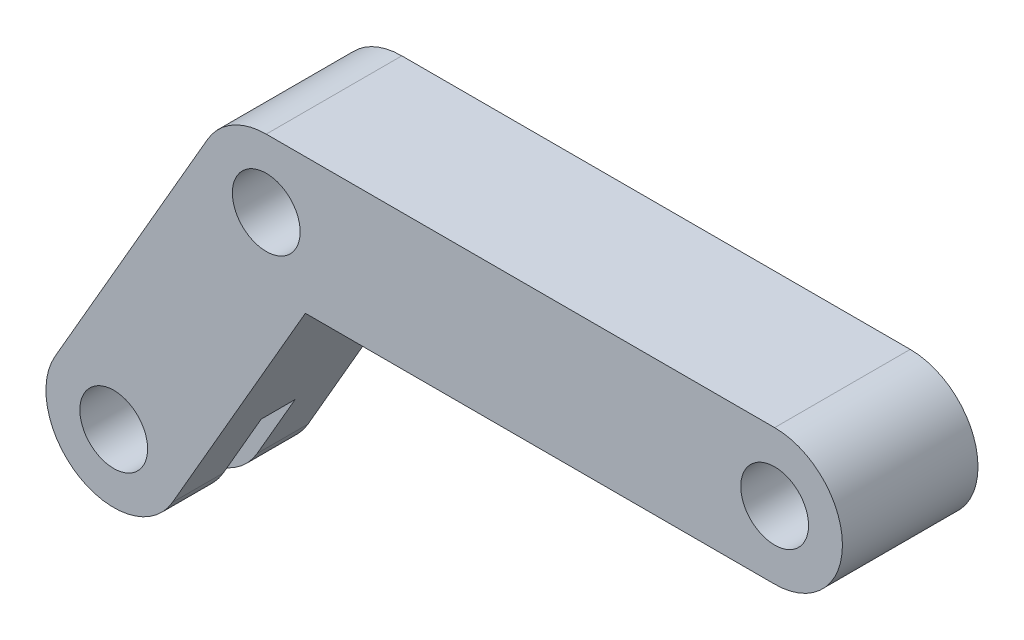
ISO-10303-21;
HEADER;
FILE_DESCRIPTION(('STEP AP214'),'2;1');
FILE_NAME('part.step','',(''),(''),'','','');
FILE_SCHEMA(('AUTOMOTIVE_DESIGN { 1 0 10303 214 1 1 1 1 }'));
ENDSEC;
DATA;
#1=APPLICATION_CONTEXT('core data for automotive mechanical design processes');
#2=APPLICATION_PROTOCOL_DEFINITION('international standard','automotive_design',2000,#1);
#3=PRODUCT_CONTEXT('',#1,'mechanical');
#4=PRODUCT('Part','Part','',(#3));
#5=PRODUCT_RELATED_PRODUCT_CATEGORY('part','',(#4));
#6=PRODUCT_DEFINITION_FORMATION('','',#4);
#7=PRODUCT_DEFINITION_CONTEXT('part definition',#1,'design');
#8=PRODUCT_DEFINITION('design','',#6,#7);
#9=PRODUCT_DEFINITION_SHAPE('','',#8);
#10=(LENGTH_UNIT() NAMED_UNIT(*) SI_UNIT(.MILLI.,.METRE.));
#11=(NAMED_UNIT(*) PLANE_ANGLE_UNIT() SI_UNIT($,.RADIAN.));
#12=(NAMED_UNIT(*) SI_UNIT($,.STERADIAN.) SOLID_ANGLE_UNIT());
#13=UNCERTAINTY_MEASURE_WITH_UNIT(LENGTH_MEASURE(1.E-05),#10,'distance_accuracy_value','');
#14=(GEOMETRIC_REPRESENTATION_CONTEXT(3) GLOBAL_UNCERTAINTY_ASSIGNED_CONTEXT((#13)) GLOBAL_UNIT_ASSIGNED_CONTEXT((#10,
#11,#12)) REPRESENTATION_CONTEXT('',''));
#15=CARTESIAN_POINT('',(0.,0.,0.));
#16=DIRECTION('',(0.,0.,1.));
#17=DIRECTION('',(1.,0.,0.));
#18=AXIS2_PLACEMENT_3D('',#15,#16,#17);
#19=CARTESIAN_POINT('',(5.77350269189626,-10.,20.));
#20=DIRECTION('',(-0.866025403784439,0.5,0.));
#21=DIRECTION('',(-0.5,-0.866025403784439,0.));
#22=AXIS2_PLACEMENT_3D('',#19,#20,#21);
#23=PLANE('',#22);
#24=DIRECTION('',(-0.5,-0.866025403784439,0.));
#25=VECTOR('',#24,1.);
#26=CARTESIAN_POINT('',(5.77350269189626,-10.,12.5));
#27=LINE('',#26,#25);
#28=CARTESIAN_POINT('',(-8.24957601840623,-34.2886848047814,12.5));
#29=VERTEX_POINT('',#28);
#30=CARTESIAN_POINT('',(-13.8397459621558,-43.9711431702996,12.5));
#31=VERTEX_POINT('',#30);
#32=EDGE_CURVE('E191',#29,#31,#27,.T.);
#33=ORIENTED_EDGE('',*,*,#32,.F.);
#34=DIRECTION('',(0.,0.,-1.));
#35=VECTOR('',#34,1.);
#36=CARTESIAN_POINT('',(-8.24957601840623,-34.2886848047814,12.5));
#37=LINE('',#36,#35);
#38=CARTESIAN_POINT('',(-8.24957601840623,-34.2886848047814,7.5));
#39=VERTEX_POINT('',#38);
#40=EDGE_CURVE('E196',#29,#39,#37,.T.);
#41=ORIENTED_EDGE('',*,*,#40,.T.);
#42=DIRECTION('',(-0.5,-0.866025403784439,0.));
#43=VECTOR('',#42,1.);
#44=CARTESIAN_POINT('',(5.77350269189626,-10.,7.5));
#45=LINE('',#44,#43);
#46=CARTESIAN_POINT('',(-13.8397459621558,-43.9711431702996,7.5));
#47=VERTEX_POINT('',#46);
#48=EDGE_CURVE('E176',#39,#47,#45,.T.);
#49=ORIENTED_EDGE('',*,*,#48,.T.);
#50=DIRECTION('',(0.,0.,-1.));
#51=VECTOR('',#50,1.);
#52=CARTESIAN_POINT('',(-13.8397459621558,-43.9711431702996,20.));
#53=LINE('',#52,#51);
#54=CARTESIAN_POINT('',(-13.8397459621558,-43.9711431702996,0.));
#55=VERTEX_POINT('',#54);
#56=EDGE_CURVE('E91',#47,#55,#53,.T.);
#57=ORIENTED_EDGE('',*,*,#56,.T.);
#58=DIRECTION('',(0.5,0.866025403784439,0.));
#59=VECTOR('',#58,1.);
#60=CARTESIAN_POINT('',(5.77350269189626,-10.,0.));
#61=LINE('',#60,#59);
#62=CARTESIAN_POINT('',(5.77350269189626,-10.,0.));
#63=VERTEX_POINT('',#62);
#64=EDGE_CURVE('E144',#55,#63,#61,.T.);
#65=ORIENTED_EDGE('',*,*,#64,.T.);
#66=DIRECTION('',(0.,0.,-1.));
#67=VECTOR('',#66,1.);
#68=CARTESIAN_POINT('',(5.77350269189626,-10.,20.));
#69=LINE('',#68,#67);
#70=CARTESIAN_POINT('',(5.77350269189626,-10.,20.));
#71=VERTEX_POINT('',#70);
#72=EDGE_CURVE('E46',#71,#63,#69,.T.);
#73=ORIENTED_EDGE('',*,*,#72,.F.);
#74=DIRECTION('',(0.5,0.866025403784439,0.));
#75=VECTOR('',#74,1.);
#76=CARTESIAN_POINT('',(5.77350269189626,-10.,20.));
#77=LINE('',#76,#75);
#78=CARTESIAN_POINT('',(-13.8397459621558,-43.9711431702996,20.));
#79=VERTEX_POINT('',#78);
#80=EDGE_CURVE('E157',#79,#71,#77,.T.);
#81=ORIENTED_EDGE('',*,*,#80,.F.);
#82=EDGE_CURVE('E159',#79,#31,#53,.T.);
#83=ORIENTED_EDGE('',*,*,#82,.T.);
#84=EDGE_LOOP('',(#33,#41,#49,#57,#65,#73,#81,#83));
#85=FACE_BOUND('',#84,.T.);
#86=ADVANCED_FACE('F39',(#85),#23,.F.);
#87=CARTESIAN_POINT('',(-8.66025403784441,4.99999999999996,20.));
#88=DIRECTION('',(0.866025403784439,-0.5,0.));
#89=DIRECTION('',(0.5,0.866025403784439,0.));
#90=AXIS2_PLACEMENT_3D('',#87,#88,#89);
#91=PLANE('',#90);
#92=DIRECTION('',(0.5,0.866025403784439,0.));
#93=VECTOR('',#92,1.);
#94=CARTESIAN_POINT('',(-8.66025403784441,4.99999999999996,12.5));
#95=LINE('',#94,#93);
#96=CARTESIAN_POINT('',(-31.1602540378446,-33.9711431702996,12.5));
#97=VERTEX_POINT('',#96);
#98=CARTESIAN_POINT('',(-25.5700840940948,-24.288684804781,12.5));
#99=VERTEX_POINT('',#98);
#100=EDGE_CURVE('E184',#97,#99,#95,.T.);
#101=ORIENTED_EDGE('',*,*,#100,.F.);
#102=DIRECTION('',(0.,0.,-1.));
#103=VECTOR('',#102,1.);
#104=CARTESIAN_POINT('',(-31.1602540378444,-33.9711431702997,20.));
#105=LINE('',#104,#103);
#106=CARTESIAN_POINT('',(-31.1602540378444,-33.9711431702997,20.));
#107=VERTEX_POINT('',#106);
#108=EDGE_CURVE('E137',#107,#97,#105,.T.);
#109=ORIENTED_EDGE('',*,*,#108,.F.);
#110=DIRECTION('',(-0.5,-0.866025403784438,0.));
#111=VECTOR('',#110,1.);
#112=CARTESIAN_POINT('',(-8.66025403784441,4.99999999999996,20.));
#113=LINE('',#112,#111);
#114=CARTESIAN_POINT('',(-8.66025403784441,4.99999999999996,20.));
#115=VERTEX_POINT('',#114);
#116=EDGE_CURVE('E116',#115,#107,#113,.T.);
#117=ORIENTED_EDGE('',*,*,#116,.F.);
#118=DIRECTION('',(0.,0.,-1.));
#119=VECTOR('',#118,1.);
#120=CARTESIAN_POINT('',(-8.66025403784441,4.99999999999996,20.));
#121=LINE('',#120,#119);
#122=CARTESIAN_POINT('',(-8.66025403784441,4.99999999999996,0.));
#123=VERTEX_POINT('',#122);
#124=EDGE_CURVE('E126',#115,#123,#121,.T.);
#125=ORIENTED_EDGE('',*,*,#124,.T.);
#126=DIRECTION('',(-0.5,-0.866025403784438,0.));
#127=VECTOR('',#126,1.);
#128=CARTESIAN_POINT('',(-8.66025403784441,4.99999999999996,0.));
#129=LINE('',#128,#127);
#130=CARTESIAN_POINT('',(-31.1602540378444,-33.9711431702997,0.));
#131=VERTEX_POINT('',#130);
#132=EDGE_CURVE('E154',#123,#131,#129,.T.);
#133=ORIENTED_EDGE('',*,*,#132,.T.);
#134=CARTESIAN_POINT('',(-31.1602540378444,-33.9711431702997,7.5));
#135=VERTEX_POINT('',#134);
#136=EDGE_CURVE('E162',#135,#131,#105,.T.);
#137=ORIENTED_EDGE('',*,*,#136,.F.);
#138=DIRECTION('',(0.5,0.866025403784439,0.));
#139=VECTOR('',#138,1.);
#140=CARTESIAN_POINT('',(-8.66025403784441,4.99999999999996,7.5));
#141=LINE('',#140,#139);
#142=CARTESIAN_POINT('',(-25.5700840940948,-24.288684804781,7.5));
#143=VERTEX_POINT('',#142);
#144=EDGE_CURVE('E52',#135,#143,#141,.T.);
#145=ORIENTED_EDGE('',*,*,#144,.T.);
#146=DIRECTION('',(0.,0.,-1.));
#147=VECTOR('',#146,1.);
#148=CARTESIAN_POINT('',(-25.5700840940948,-24.288684804781,12.5));
#149=LINE('',#148,#147);
#150=EDGE_CURVE('E11',#143,#99,#149,.F.);
#151=ORIENTED_EDGE('',*,*,#150,.T.);
#152=EDGE_LOOP('',(#101,#109,#117,#125,#133,#137,#145,#151));
#153=FACE_BOUND('',#152,.T.);
#154=ADVANCED_FACE('F139',(#153),#91,.F.);
#155=CARTESIAN_POINT('',(-22.5000000000002,-38.9711431702996,20.));
#156=DIRECTION('',(0.,0.,-1.));
#157=DIRECTION('',(-1.,0.,0.));
#158=AXIS2_PLACEMENT_3D('',#155,#156,#157);
#159=CYLINDRICAL_SURFACE('',#158,10.);
#160=CARTESIAN_POINT('',(-22.5000000000002,-38.9711431702996,12.5));
#161=DIRECTION('',(0.,0.,-1.));
#162=DIRECTION('',(-1.,0.,0.));
#163=AXIS2_PLACEMENT_3D('',#160,#161,#162);
#164=CIRCLE('',#163,10.);
#165=EDGE_CURVE('E179',#31,#97,#164,.T.);
#166=ORIENTED_EDGE('',*,*,#165,.F.);
#167=ORIENTED_EDGE('',*,*,#82,.F.);
#168=CARTESIAN_POINT('',(-22.5000000000002,-38.9711431702996,20.));
#169=DIRECTION('',(0.,0.,1.));
#170=DIRECTION('',(-1.,0.,0.));
#171=AXIS2_PLACEMENT_3D('',#168,#169,#170);
#172=CIRCLE('',#171,10.);
#173=EDGE_CURVE('E65',#107,#79,#172,.T.);
#174=ORIENTED_EDGE('',*,*,#173,.F.);
#175=ORIENTED_EDGE('',*,*,#108,.T.);
#176=EDGE_LOOP('',(#166,#167,#174,#175));
#177=FACE_BOUND('',#176,.T.);
#178=ADVANCED_FACE('F256',(#177),#159,.T.);
#179=CARTESIAN_POINT('',(-22.5000000000002,-38.9711431702996,20.));
#180=DIRECTION('',(0.,0.,-1.));
#181=DIRECTION('',(-1.,0.,0.));
#182=AXIS2_PLACEMENT_3D('',#179,#180,#181);
#183=CYLINDRICAL_SURFACE('',#182,5.);
#184=CARTESIAN_POINT('',(-22.5000000000002,-38.9711431702996,20.));
#185=DIRECTION('',(0.,0.,1.));
#186=DIRECTION('',(1.,0.,0.));
#187=AXIS2_PLACEMENT_3D('',#184,#185,#186);
#188=CIRCLE('',#187,5.);
#189=CARTESIAN_POINT('',(-17.5000000000002,-38.9711431702996,20.));
#190=VERTEX_POINT('',#189);
#191=EDGE_CURVE('E146',#190,#190,#188,.T.);
#192=ORIENTED_EDGE('',*,*,#191,.T.);
#193=EDGE_LOOP('',(#192));
#194=FACE_BOUND('',#193,.T.);
#195=CARTESIAN_POINT('',(-22.5000000000002,-38.9711431702996,12.5));
#196=DIRECTION('',(0.,0.,-1.));
#197=DIRECTION('',(-1.,0.,0.));
#198=AXIS2_PLACEMENT_3D('',#195,#196,#197);
#199=CIRCLE('',#198,5.);
#200=CARTESIAN_POINT('',(-27.5000000000002,-38.9711431702996,12.5));
#201=VERTEX_POINT('',#200);
#202=EDGE_CURVE('E180',#201,#201,#199,.T.);
#203=ORIENTED_EDGE('',*,*,#202,.T.);
#204=EDGE_LOOP('',(#203));
#205=FACE_BOUND('',#204,.T.);
#206=ADVANCED_FACE('F284',(#194,#205),#183,.F.);
#207=CARTESIAN_POINT('',(-22.5000000000002,-38.9711431702996,20.));
#208=DIRECTION('',(0.,0.,-1.));
#209=DIRECTION('',(-1.,0.,0.));
#210=AXIS2_PLACEMENT_3D('',#207,#208,#209);
#211=PLANE('',#210);
#212=ORIENTED_EDGE('',*,*,#80,.T.);
#213=DIRECTION('',(1.,0.,0.));
#214=VECTOR('',#213,1.);
#215=CARTESIAN_POINT('',(5.77350269189626,-10.,20.));
#216=LINE('',#215,#214);
#217=CARTESIAN_POINT('',(75.,-10.,20.));
#218=VERTEX_POINT('',#217);
#219=EDGE_CURVE('E105',#71,#218,#216,.T.);
#220=ORIENTED_EDGE('',*,*,#219,.T.);
#221=CARTESIAN_POINT('',(75.,0.,20.));
#222=DIRECTION('',(0.,0.,1.));
#223=DIRECTION('',(1.,0.,0.));
#224=AXIS2_PLACEMENT_3D('',#221,#222,#223);
#225=CIRCLE('',#224,10.);
#226=CARTESIAN_POINT('',(75.,10.,20.));
#227=VERTEX_POINT('',#226);
#228=EDGE_CURVE('E218',#218,#227,#225,.T.);
#229=ORIENTED_EDGE('',*,*,#228,.T.);
#230=DIRECTION('',(-1.,0.,0.));
#231=VECTOR('',#230,1.);
#232=CARTESIAN_POINT('',(0.,10.,20.));
#233=LINE('',#232,#231);
#234=CARTESIAN_POINT('',(0.,10.,20.));
#235=VERTEX_POINT('',#234);
#236=EDGE_CURVE('E125',#227,#235,#233,.T.);
#237=ORIENTED_EDGE('',*,*,#236,.T.);
#238=CARTESIAN_POINT('',(0.,0.,20.));
#239=DIRECTION('',(0.,0.,1.));
#240=DIRECTION('',(1.,0.,0.));
#241=AXIS2_PLACEMENT_3D('',#238,#239,#240);
#242=CIRCLE('',#241,10.);
#243=EDGE_CURVE('E111',#235,#115,#242,.T.);
#244=ORIENTED_EDGE('',*,*,#243,.T.);
#245=ORIENTED_EDGE('',*,*,#116,.T.);
#246=ORIENTED_EDGE('',*,*,#173,.T.);
#247=EDGE_LOOP('',(#212,#220,#229,#237,#244,#245,#246));
#248=FACE_BOUND('',#247,.T.);
#249=ORIENTED_EDGE('',*,*,#191,.F.);
#250=EDGE_LOOP('',(#249));
#251=FACE_BOUND('',#250,.T.);
#252=CARTESIAN_POINT('',(0.,0.,20.));
#253=DIRECTION('',(0.,0.,1.));
#254=DIRECTION('',(1.,0.,0.));
#255=AXIS2_PLACEMENT_3D('',#252,#253,#254);
#256=CIRCLE('',#255,5.);
#257=CARTESIAN_POINT('',(5.,0.,20.));
#258=VERTEX_POINT('',#257);
#259=EDGE_CURVE('E210',#258,#258,#256,.T.);
#260=ORIENTED_EDGE('',*,*,#259,.F.);
#261=EDGE_LOOP('',(#260));
#262=FACE_BOUND('',#261,.T.);
#263=CARTESIAN_POINT('',(75.,0.,20.));
#264=DIRECTION('',(0.,0.,1.));
#265=DIRECTION('',(1.,0.,0.));
#266=AXIS2_PLACEMENT_3D('',#263,#264,#265);
#267=CIRCLE('',#266,5.);
#268=CARTESIAN_POINT('',(80.,0.,20.));
#269=VERTEX_POINT('',#268);
#270=EDGE_CURVE('E203',#269,#269,#267,.T.);
#271=ORIENTED_EDGE('',*,*,#270,.F.);
#272=EDGE_LOOP('',(#271));
#273=FACE_BOUND('',#272,.T.);
#274=ADVANCED_FACE('F117',(#248,#251,#262,#273),#211,.F.);
#275=CARTESIAN_POINT('',(-22.5000000000002,-38.9711431702996,0.));
#276=DIRECTION('',(0.,0.,-1.));
#277=DIRECTION('',(-1.,0.,0.));
#278=AXIS2_PLACEMENT_3D('',#275,#276,#277);
#279=PLANE('',#278);
#280=CARTESIAN_POINT('',(0.,0.,0.));
#281=DIRECTION('',(0.,0.,1.));
#282=DIRECTION('',(1.,0.,0.));
#283=AXIS2_PLACEMENT_3D('',#280,#281,#282);
#284=CIRCLE('',#283,5.);
#285=CARTESIAN_POINT('',(5.,0.,0.));
#286=VERTEX_POINT('',#285);
#287=EDGE_CURVE('E204',#286,#286,#284,.T.);
#288=ORIENTED_EDGE('',*,*,#287,.T.);
#289=EDGE_LOOP('',(#288));
#290=FACE_BOUND('',#289,.T.);
#291=ORIENTED_EDGE('',*,*,#64,.F.);
#292=CARTESIAN_POINT('',(-22.5000000000002,-38.9711431702996,0.));
#293=DIRECTION('',(0.,0.,1.));
#294=DIRECTION('',(-1.,0.,0.));
#295=AXIS2_PLACEMENT_3D('',#292,#293,#294);
#296=CIRCLE('',#295,10.);
#297=EDGE_CURVE('E160',#131,#55,#296,.T.);
#298=ORIENTED_EDGE('',*,*,#297,.F.);
#299=ORIENTED_EDGE('',*,*,#132,.F.);
#300=CARTESIAN_POINT('',(0.,0.,0.));
#301=DIRECTION('',(0.,0.,1.));
#302=DIRECTION('',(1.,0.,0.));
#303=AXIS2_PLACEMENT_3D('',#300,#301,#302);
#304=CIRCLE('',#303,10.);
#305=CARTESIAN_POINT('',(0.,10.,0.));
#306=VERTEX_POINT('',#305);
#307=EDGE_CURVE('E132',#306,#123,#304,.T.);
#308=ORIENTED_EDGE('',*,*,#307,.F.);
#309=DIRECTION('',(-1.,0.,0.));
#310=VECTOR('',#309,1.);
#311=CARTESIAN_POINT('',(0.,10.,0.));
#312=LINE('',#311,#310);
#313=CARTESIAN_POINT('',(75.,10.,0.));
#314=VERTEX_POINT('',#313);
#315=EDGE_CURVE('E155',#314,#306,#312,.T.);
#316=ORIENTED_EDGE('',*,*,#315,.F.);
#317=CARTESIAN_POINT('',(75.,0.,0.));
#318=DIRECTION('',(0.,0.,1.));
#319=DIRECTION('',(1.,0.,0.));
#320=AXIS2_PLACEMENT_3D('',#317,#318,#319);
#321=CIRCLE('',#320,10.);
#322=CARTESIAN_POINT('',(75.,-10.,0.));
#323=VERTEX_POINT('',#322);
#324=EDGE_CURVE('E147',#323,#314,#321,.T.);
#325=ORIENTED_EDGE('',*,*,#324,.F.);
#326=DIRECTION('',(1.,0.,0.));
#327=VECTOR('',#326,1.);
#328=CARTESIAN_POINT('',(5.77350269189626,-10.,0.));
#329=LINE('',#328,#327);
#330=EDGE_CURVE('E150',#63,#323,#329,.T.);
#331=ORIENTED_EDGE('',*,*,#330,.F.);
#332=EDGE_LOOP('',(#291,#298,#299,#308,#316,#325,#331));
#333=FACE_BOUND('',#332,.T.);
#334=CARTESIAN_POINT('',(-22.5000000000002,-38.9711431702996,0.));
#335=DIRECTION('',(0.,0.,1.));
#336=DIRECTION('',(1.,0.,0.));
#337=AXIS2_PLACEMENT_3D('',#334,#335,#336);
#338=CIRCLE('',#337,5.);
#339=CARTESIAN_POINT('',(-17.5000000000002,-38.9711431702996,0.));
#340=VERTEX_POINT('',#339);
#341=EDGE_CURVE('E209',#340,#340,#338,.T.);
#342=ORIENTED_EDGE('',*,*,#341,.T.);
#343=EDGE_LOOP('',(#342));
#344=FACE_BOUND('',#343,.T.);
#345=CARTESIAN_POINT('',(75.,0.,0.));
#346=DIRECTION('',(0.,0.,1.));
#347=DIRECTION('',(1.,0.,0.));
#348=AXIS2_PLACEMENT_3D('',#345,#346,#347);
#349=CIRCLE('',#348,5.);
#350=CARTESIAN_POINT('',(80.,0.,0.));
#351=VERTEX_POINT('',#350);
#352=EDGE_CURVE('E199',#351,#351,#349,.T.);
#353=ORIENTED_EDGE('',*,*,#352,.T.);
#354=EDGE_LOOP('',(#353));
#355=FACE_BOUND('',#354,.T.);
#356=ADVANCED_FACE('F228',(#290,#333,#344,#355),#279,.T.);
#357=CARTESIAN_POINT('',(5.77350269189626,-10.,20.));
#358=DIRECTION('',(0.,1.,0.));
#359=DIRECTION('',(0.,0.,1.));
#360=AXIS2_PLACEMENT_3D('',#357,#358,#359);
#361=PLANE('',#360);
#362=ORIENTED_EDGE('',*,*,#330,.T.);
#363=DIRECTION('',(0.,0.,-1.));
#364=VECTOR('',#363,1.);
#365=CARTESIAN_POINT('',(75.,-10.,20.));
#366=LINE('',#365,#364);
#367=EDGE_CURVE('E166',#218,#323,#366,.T.);
#368=ORIENTED_EDGE('',*,*,#367,.F.);
#369=ORIENTED_EDGE('',*,*,#219,.F.);
#370=ORIENTED_EDGE('',*,*,#72,.T.);
#371=EDGE_LOOP('',(#362,#368,#369,#370));
#372=FACE_BOUND('',#371,.T.);
#373=ADVANCED_FACE('F295',(#372),#361,.F.);
#374=CARTESIAN_POINT('',(75.,0.,20.));
#375=DIRECTION('',(0.,0.,-1.));
#376=DIRECTION('',(-1.,0.,0.));
#377=AXIS2_PLACEMENT_3D('',#374,#375,#376);
#378=CYLINDRICAL_SURFACE('',#377,10.);
#379=ORIENTED_EDGE('',*,*,#324,.T.);
#380=DIRECTION('',(0.,0.,-1.));
#381=VECTOR('',#380,1.);
#382=CARTESIAN_POINT('',(75.,10.,20.));
#383=LINE('',#382,#381);
#384=EDGE_CURVE('E167',#227,#314,#383,.T.);
#385=ORIENTED_EDGE('',*,*,#384,.F.);
#386=ORIENTED_EDGE('',*,*,#228,.F.);
#387=ORIENTED_EDGE('',*,*,#367,.T.);
#388=EDGE_LOOP('',(#379,#385,#386,#387));
#389=FACE_BOUND('',#388,.T.);
#390=ADVANCED_FACE('F224',(#389),#378,.T.);
#391=CARTESIAN_POINT('',(0.,10.,20.));
#392=DIRECTION('',(0.,-1.,0.));
#393=DIRECTION('',(0.,0.,-1.));
#394=AXIS2_PLACEMENT_3D('',#391,#392,#393);
#395=PLANE('',#394);
#396=ORIENTED_EDGE('',*,*,#315,.T.);
#397=DIRECTION('',(0.,0.,-1.));
#398=VECTOR('',#397,1.);
#399=CARTESIAN_POINT('',(0.,10.,20.));
#400=LINE('',#399,#398);
#401=EDGE_CURVE('E133',#235,#306,#400,.T.);
#402=ORIENTED_EDGE('',*,*,#401,.F.);
#403=ORIENTED_EDGE('',*,*,#236,.F.);
#404=ORIENTED_EDGE('',*,*,#384,.T.);
#405=EDGE_LOOP('',(#396,#402,#403,#404));
#406=FACE_BOUND('',#405,.T.);
#407=ADVANCED_FACE('F230',(#406),#395,.F.);
#408=CARTESIAN_POINT('',(0.,0.,20.));
#409=DIRECTION('',(0.,0.,-1.));
#410=DIRECTION('',(-1.,0.,0.));
#411=AXIS2_PLACEMENT_3D('',#408,#409,#410);
#412=CYLINDRICAL_SURFACE('',#411,10.);
#413=ORIENTED_EDGE('',*,*,#307,.T.);
#414=ORIENTED_EDGE('',*,*,#124,.F.);
#415=ORIENTED_EDGE('',*,*,#243,.F.);
#416=ORIENTED_EDGE('',*,*,#401,.T.);
#417=EDGE_LOOP('',(#413,#414,#415,#416));
#418=FACE_BOUND('',#417,.T.);
#419=ADVANCED_FACE('F129',(#418),#412,.T.);
#420=ORIENTED_EDGE('',*,*,#56,.F.);
#421=CARTESIAN_POINT('',(-22.5000000000002,-38.9711431702996,7.5));
#422=DIRECTION('',(0.,0.,-1.));
#423=DIRECTION('',(-1.,0.,0.));
#424=AXIS2_PLACEMENT_3D('',#421,#422,#423);
#425=CIRCLE('',#424,10.);
#426=EDGE_CURVE('E173',#47,#135,#425,.T.);
#427=ORIENTED_EDGE('',*,*,#426,.T.);
#428=ORIENTED_EDGE('',*,*,#136,.T.);
#429=ORIENTED_EDGE('',*,*,#297,.T.);
#430=EDGE_LOOP('',(#420,#427,#428,#429));
#431=FACE_BOUND('',#430,.T.);
#432=ADVANCED_FACE('F237',(#431),#159,.T.);
#433=CARTESIAN_POINT('',(-22.5000000000002,-38.9711431702996,7.5));
#434=DIRECTION('',(0.,0.,-1.));
#435=DIRECTION('',(-1.,0.,0.));
#436=AXIS2_PLACEMENT_3D('',#433,#434,#435);
#437=CIRCLE('',#436,5.);
#438=CARTESIAN_POINT('',(-27.5000000000002,-38.9711431702996,7.5));
#439=VERTEX_POINT('',#438);
#440=EDGE_CURVE('E174',#439,#439,#437,.T.);
#441=ORIENTED_EDGE('',*,*,#440,.F.);
#442=EDGE_LOOP('',(#441));
#443=FACE_BOUND('',#442,.T.);
#444=ORIENTED_EDGE('',*,*,#341,.F.);
#445=EDGE_LOOP('',(#444));
#446=FACE_BOUND('',#445,.T.);
#447=ADVANCED_FACE('F303',(#443,#446),#183,.F.);
#448=CARTESIAN_POINT('',(0.,0.,20.));
#449=DIRECTION('',(0.,0.,-1.));
#450=DIRECTION('',(-1.,0.,0.));
#451=AXIS2_PLACEMENT_3D('',#448,#449,#450);
#452=CYLINDRICAL_SURFACE('',#451,5.);
#453=ORIENTED_EDGE('',*,*,#259,.T.);
#454=EDGE_LOOP('',(#453));
#455=FACE_BOUND('',#454,.T.);
#456=ORIENTED_EDGE('',*,*,#287,.F.);
#457=EDGE_LOOP('',(#456));
#458=FACE_BOUND('',#457,.T.);
#459=ADVANCED_FACE('F308',(#455,#458),#452,.F.);
#460=CARTESIAN_POINT('',(75.,0.,20.));
#461=DIRECTION('',(0.,0.,-1.));
#462=DIRECTION('',(-1.,0.,0.));
#463=AXIS2_PLACEMENT_3D('',#460,#461,#462);
#464=CYLINDRICAL_SURFACE('',#463,5.);
#465=ORIENTED_EDGE('',*,*,#270,.T.);
#466=EDGE_LOOP('',(#465));
#467=FACE_BOUND('',#466,.T.);
#468=ORIENTED_EDGE('',*,*,#352,.F.);
#469=EDGE_LOOP('',(#468));
#470=FACE_BOUND('',#469,.T.);
#471=ADVANCED_FACE('F309',(#467,#470),#464,.F.);
#472=CARTESIAN_POINT('',(-22.5000000000002,-38.9711431702996,12.5));
#473=DIRECTION('',(0.,0.,-1.));
#474=DIRECTION('',(-1.,0.,0.));
#475=AXIS2_PLACEMENT_3D('',#472,#473,#474);
#476=CYLINDRICAL_SURFACE('',#475,15.);
#477=CARTESIAN_POINT('',(-22.5000000000002,-38.9711431702996,12.5));
#478=DIRECTION('',(0.,0.,-1.));
#479=DIRECTION('',(-1.,0.,0.));
#480=AXIS2_PLACEMENT_3D('',#477,#478,#479);
#481=CIRCLE('',#480,15.);
#482=EDGE_CURVE('E177',#99,#29,#481,.T.);
#483=ORIENTED_EDGE('',*,*,#482,.F.);
#484=ORIENTED_EDGE('',*,*,#150,.F.);
#485=CARTESIAN_POINT('',(-22.5000000000002,-38.9711431702996,7.5));
#486=DIRECTION('',(0.,0.,-1.));
#487=DIRECTION('',(-1.,0.,0.));
#488=AXIS2_PLACEMENT_3D('',#485,#486,#487);
#489=CIRCLE('',#488,15.);
#490=EDGE_CURVE('E236',#143,#39,#489,.T.);
#491=ORIENTED_EDGE('',*,*,#490,.T.);
#492=ORIENTED_EDGE('',*,*,#40,.F.);
#493=EDGE_LOOP('',(#483,#484,#491,#492));
#494=FACE_BOUND('',#493,.T.);
#495=ADVANCED_FACE('F257',(#494),#476,.F.);
#496=CARTESIAN_POINT('',(-22.5000000000002,-38.9711431702996,12.5));
#497=DIRECTION('',(0.,0.,-1.));
#498=DIRECTION('',(-1.,0.,0.));
#499=AXIS2_PLACEMENT_3D('',#496,#497,#498);
#500=PLANE('',#499);
#501=ORIENTED_EDGE('',*,*,#202,.F.);
#502=EDGE_LOOP('',(#501));
#503=FACE_BOUND('',#502,.T.);
#504=ORIENTED_EDGE('',*,*,#32,.T.);
#505=ORIENTED_EDGE('',*,*,#165,.T.);
#506=ORIENTED_EDGE('',*,*,#100,.T.);
#507=ORIENTED_EDGE('',*,*,#482,.T.);
#508=EDGE_LOOP('',(#504,#505,#506,#507));
#509=FACE_BOUND('',#508,.T.);
#510=ADVANCED_FACE('F247',(#503,#509),#500,.T.);
#511=CARTESIAN_POINT('',(-22.5000000000002,-38.9711431702996,7.5));
#512=DIRECTION('',(0.,0.,-1.));
#513=DIRECTION('',(-1.,0.,0.));
#514=AXIS2_PLACEMENT_3D('',#511,#512,#513);
#515=PLANE('',#514);
#516=ORIENTED_EDGE('',*,*,#440,.T.);
#517=EDGE_LOOP('',(#516));
#518=FACE_BOUND('',#517,.T.);
#519=ORIENTED_EDGE('',*,*,#490,.F.);
#520=ORIENTED_EDGE('',*,*,#144,.F.);
#521=ORIENTED_EDGE('',*,*,#426,.F.);
#522=ORIENTED_EDGE('',*,*,#48,.F.);
#523=EDGE_LOOP('',(#519,#520,#521,#522));
#524=FACE_BOUND('',#523,.T.);
#525=ADVANCED_FACE('F265',(#518,#524),#515,.F.);
#526=CLOSED_SHELL('',(#86,#154,#178,#206,#274,#356,#373,#390,#407,#419,#432,#447,#459,#471,#495,
#510,#525));
#527=MANIFOLD_SOLID_BREP('B2',#526);
#528=ADVANCED_BREP_SHAPE_REPRESENTATION('',(#18,#527),#14);
#529=SHAPE_DEFINITION_REPRESENTATION(#9,#528);
ENDSEC;
END-ISO-10303-21;
